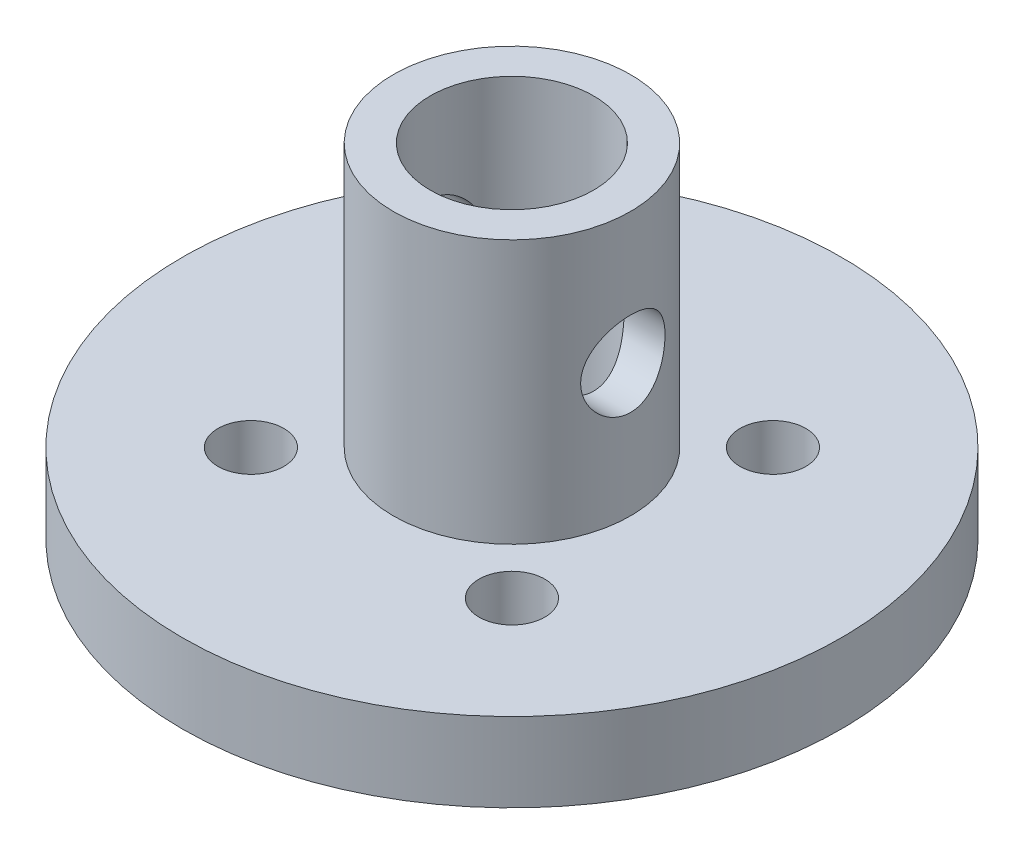
ISO-10303-21;
HEADER;
FILE_DESCRIPTION(('STEP AP214'),'2;1');
FILE_NAME('part.step','',(''),(''),'','','');
FILE_SCHEMA(('AUTOMOTIVE_DESIGN { 1 0 10303 214 1 1 1 1 }'));
ENDSEC;
DATA;
#1=APPLICATION_CONTEXT('core data for automotive mechanical design processes');
#2=APPLICATION_PROTOCOL_DEFINITION('international standard','automotive_design',2000,#1);
#3=PRODUCT_CONTEXT('',#1,'mechanical');
#4=PRODUCT('Part','Part','',(#3));
#5=PRODUCT_RELATED_PRODUCT_CATEGORY('part','',(#4));
#6=PRODUCT_DEFINITION_FORMATION('','',#4);
#7=PRODUCT_DEFINITION_CONTEXT('part definition',#1,'design');
#8=PRODUCT_DEFINITION('design','',#6,#7);
#9=PRODUCT_DEFINITION_SHAPE('','',#8);
#10=(LENGTH_UNIT() NAMED_UNIT(*) SI_UNIT(.MILLI.,.METRE.));
#11=(NAMED_UNIT(*) PLANE_ANGLE_UNIT() SI_UNIT($,.RADIAN.));
#12=(NAMED_UNIT(*) SI_UNIT($,.STERADIAN.) SOLID_ANGLE_UNIT());
#13=UNCERTAINTY_MEASURE_WITH_UNIT(LENGTH_MEASURE(1.E-05),#10,'distance_accuracy_value','');
#14=(GEOMETRIC_REPRESENTATION_CONTEXT(3) GLOBAL_UNCERTAINTY_ASSIGNED_CONTEXT((#13)) GLOBAL_UNIT_ASSIGNED_CONTEXT((#10,
#11,#12)) REPRESENTATION_CONTEXT('',''));
#15=CARTESIAN_POINT('',(0.,0.,0.));
#16=DIRECTION('',(0.,0.,1.));
#17=DIRECTION('',(1.,0.,0.));
#18=AXIS2_PLACEMENT_3D('',#15,#16,#17);
#19=CARTESIAN_POINT('',(-4.94974746830584,3.,-4.94974746830582));
#20=DIRECTION('',(0.,-1.,0.));
#21=DIRECTION('',(0.,0.,-1.));
#22=AXIS2_PLACEMENT_3D('',#19,#20,#21);
#23=CYLINDRICAL_SURFACE('',#22,1.25);
#24=CARTESIAN_POINT('',(-4.94974746830584,3.,-4.94974746830582));
#25=DIRECTION('',(0.,1.,0.));
#26=DIRECTION('',(0.,0.,1.));
#27=AXIS2_PLACEMENT_3D('',#24,#25,#26);
#28=CIRCLE('',#27,1.25);
#29=CARTESIAN_POINT('',(-4.94974746830584,3.,-3.69974746830582));
#30=VERTEX_POINT('',#29);
#31=EDGE_CURVE('E72',#30,#30,#28,.T.);
#32=ORIENTED_EDGE('',*,*,#31,.T.);
#33=EDGE_LOOP('',(#32));
#34=FACE_BOUND('',#33,.T.);
#35=CARTESIAN_POINT('',(-4.94974746830584,0.,-4.94974746830582));
#36=DIRECTION('',(0.,1.,0.));
#37=DIRECTION('',(0.,0.,1.));
#38=AXIS2_PLACEMENT_3D('',#35,#36,#37);
#39=CIRCLE('',#38,1.25);
#40=CARTESIAN_POINT('',(-4.94974746830584,0.,-3.69974746830582));
#41=VERTEX_POINT('',#40);
#42=EDGE_CURVE('E104',#41,#41,#39,.T.);
#43=ORIENTED_EDGE('',*,*,#42,.F.);
#44=EDGE_LOOP('',(#43));
#45=FACE_BOUND('',#44,.T.);
#46=ADVANCED_FACE('F51',(#34,#45),#23,.F.);
#47=CARTESIAN_POINT('',(4.94974746830584,3.,-4.94974746830581));
#48=DIRECTION('',(0.,-1.,0.));
#49=DIRECTION('',(0.,0.,-1.));
#50=AXIS2_PLACEMENT_3D('',#47,#48,#49);
#51=CYLINDRICAL_SURFACE('',#50,1.25);
#52=CARTESIAN_POINT('',(4.94974746830584,3.,-4.94974746830581));
#53=DIRECTION('',(0.,1.,0.));
#54=DIRECTION('',(0.,0.,1.));
#55=AXIS2_PLACEMENT_3D('',#52,#53,#54);
#56=CIRCLE('',#55,1.25);
#57=CARTESIAN_POINT('',(4.94974746830584,3.,-3.69974746830581));
#58=VERTEX_POINT('',#57);
#59=EDGE_CURVE('E88',#58,#58,#56,.T.);
#60=ORIENTED_EDGE('',*,*,#59,.T.);
#61=EDGE_LOOP('',(#60));
#62=FACE_BOUND('',#61,.T.);
#63=CARTESIAN_POINT('',(4.94974746830584,0.,-4.94974746830581));
#64=DIRECTION('',(0.,1.,0.));
#65=DIRECTION('',(0.,0.,1.));
#66=AXIS2_PLACEMENT_3D('',#63,#64,#65);
#67=CIRCLE('',#66,1.25);
#68=CARTESIAN_POINT('',(4.94974746830584,0.,-3.69974746830581));
#69=VERTEX_POINT('',#68);
#70=EDGE_CURVE('E101',#69,#69,#67,.T.);
#71=ORIENTED_EDGE('',*,*,#70,.F.);
#72=EDGE_LOOP('',(#71));
#73=FACE_BOUND('',#72,.T.);
#74=ADVANCED_FACE('F163',(#62,#73),#51,.F.);
#75=CARTESIAN_POINT('',(4.94974746830582,3.,4.94974746830587));
#76=DIRECTION('',(0.,-1.,0.));
#77=DIRECTION('',(0.,0.,-1.));
#78=AXIS2_PLACEMENT_3D('',#75,#76,#77);
#79=CYLINDRICAL_SURFACE('',#78,1.25);
#80=CARTESIAN_POINT('',(4.94974746830582,3.,4.94974746830587));
#81=DIRECTION('',(0.,1.,0.));
#82=DIRECTION('',(0.,0.,1.));
#83=AXIS2_PLACEMENT_3D('',#80,#81,#82);
#84=CIRCLE('',#83,1.25);
#85=CARTESIAN_POINT('',(4.94974746830582,3.,6.19974746830587));
#86=VERTEX_POINT('',#85);
#87=EDGE_CURVE('E82',#86,#86,#84,.T.);
#88=ORIENTED_EDGE('',*,*,#87,.T.);
#89=EDGE_LOOP('',(#88));
#90=FACE_BOUND('',#89,.T.);
#91=CARTESIAN_POINT('',(4.94974746830582,0.,4.94974746830587));
#92=DIRECTION('',(0.,1.,0.));
#93=DIRECTION('',(0.,0.,1.));
#94=AXIS2_PLACEMENT_3D('',#91,#92,#93);
#95=CIRCLE('',#94,1.25);
#96=CARTESIAN_POINT('',(4.94974746830582,0.,6.19974746830587));
#97=VERTEX_POINT('',#96);
#98=EDGE_CURVE('E100',#97,#97,#95,.T.);
#99=ORIENTED_EDGE('',*,*,#98,.F.);
#100=EDGE_LOOP('',(#99));
#101=FACE_BOUND('',#100,.T.);
#102=ADVANCED_FACE('F170',(#90,#101),#79,.F.);
#103=CARTESIAN_POINT('',(-4.94974746830585,3.,4.94974746830587));
#104=DIRECTION('',(0.,-1.,0.));
#105=DIRECTION('',(0.,0.,-1.));
#106=AXIS2_PLACEMENT_3D('',#103,#104,#105);
#107=CYLINDRICAL_SURFACE('',#106,1.25);
#108=CARTESIAN_POINT('',(-4.94974746830585,3.,4.94974746830587));
#109=DIRECTION('',(0.,1.,0.));
#110=DIRECTION('',(0.,0.,1.));
#111=AXIS2_PLACEMENT_3D('',#108,#109,#110);
#112=CIRCLE('',#111,1.25);
#113=CARTESIAN_POINT('',(-4.94974746830585,3.,6.19974746830587));
#114=VERTEX_POINT('',#113);
#115=EDGE_CURVE('E79',#114,#114,#112,.T.);
#116=ORIENTED_EDGE('',*,*,#115,.T.);
#117=EDGE_LOOP('',(#116));
#118=FACE_BOUND('',#117,.T.);
#119=CARTESIAN_POINT('',(-4.94974746830585,0.,4.94974746830587));
#120=DIRECTION('',(0.,1.,0.));
#121=DIRECTION('',(0.,0.,1.));
#122=AXIS2_PLACEMENT_3D('',#119,#120,#121);
#123=CIRCLE('',#122,1.25);
#124=CARTESIAN_POINT('',(-4.94974746830585,0.,6.19974746830587));
#125=VERTEX_POINT('',#124);
#126=EDGE_CURVE('E91',#125,#125,#123,.T.);
#127=ORIENTED_EDGE('',*,*,#126,.F.);
#128=EDGE_LOOP('',(#127));
#129=FACE_BOUND('',#128,.T.);
#130=ADVANCED_FACE('F52',(#118,#129),#107,.F.);
#131=CARTESIAN_POINT('',(0.,3.,0.));
#132=DIRECTION('',(0.,-1.,0.));
#133=DIRECTION('',(0.,0.,-1.));
#134=AXIS2_PLACEMENT_3D('',#131,#132,#133);
#135=CYLINDRICAL_SURFACE('',#134,12.5);
#136=CARTESIAN_POINT('',(0.,3.,0.));
#137=DIRECTION('',(0.,1.,0.));
#138=DIRECTION('',(0.,0.,1.));
#139=AXIS2_PLACEMENT_3D('',#136,#137,#138);
#140=CIRCLE('',#139,12.5);
#141=CARTESIAN_POINT('',(0.,3.,12.5));
#142=VERTEX_POINT('',#141);
#143=EDGE_CURVE('E61',#142,#142,#140,.T.);
#144=ORIENTED_EDGE('',*,*,#143,.F.);
#145=EDGE_LOOP('',(#144));
#146=FACE_BOUND('',#145,.T.);
#147=CARTESIAN_POINT('',(0.,0.,0.));
#148=DIRECTION('',(0.,1.,0.));
#149=DIRECTION('',(0.,0.,1.));
#150=AXIS2_PLACEMENT_3D('',#147,#148,#149);
#151=CIRCLE('',#150,12.5);
#152=CARTESIAN_POINT('',(0.,0.,12.5));
#153=VERTEX_POINT('',#152);
#154=EDGE_CURVE('E84',#153,#153,#151,.T.);
#155=ORIENTED_EDGE('',*,*,#154,.T.);
#156=EDGE_LOOP('',(#155));
#157=FACE_BOUND('',#156,.T.);
#158=ADVANCED_FACE('F153',(#146,#157),#135,.T.);
#159=CARTESIAN_POINT('',(0.,3.,0.));
#160=DIRECTION('',(0.,1.,0.));
#161=DIRECTION('',(0.,0.,1.));
#162=AXIS2_PLACEMENT_3D('',#159,#160,#161);
#163=PLANE('',#162);
#164=CARTESIAN_POINT('',(0.,3.,0.));
#165=DIRECTION('',(0.,1.,0.));
#166=DIRECTION('',(0.,0.,1.));
#167=AXIS2_PLACEMENT_3D('',#164,#165,#166);
#168=CIRCLE('',#167,4.5);
#169=CARTESIAN_POINT('',(0.,3.,4.5));
#170=VERTEX_POINT('',#169);
#171=EDGE_CURVE('E11',#170,#170,#168,.T.);
#172=ORIENTED_EDGE('',*,*,#171,.F.);
#173=EDGE_LOOP('',(#172));
#174=FACE_BOUND('',#173,.T.);
#175=ORIENTED_EDGE('',*,*,#115,.F.);
#176=EDGE_LOOP('',(#175));
#177=FACE_BOUND('',#176,.T.);
#178=ORIENTED_EDGE('',*,*,#87,.F.);
#179=EDGE_LOOP('',(#178));
#180=FACE_BOUND('',#179,.T.);
#181=ORIENTED_EDGE('',*,*,#59,.F.);
#182=EDGE_LOOP('',(#181));
#183=FACE_BOUND('',#182,.T.);
#184=ORIENTED_EDGE('',*,*,#31,.F.);
#185=EDGE_LOOP('',(#184));
#186=FACE_BOUND('',#185,.T.);
#187=ORIENTED_EDGE('',*,*,#143,.T.);
#188=EDGE_LOOP('',(#187));
#189=FACE_BOUND('',#188,.T.);
#190=ADVANCED_FACE('F146',(#174,#177,#180,#183,#186,#189),#163,.T.);
#191=CARTESIAN_POINT('',(0.,0.,0.));
#192=DIRECTION('',(0.,1.,0.));
#193=DIRECTION('',(0.,0.,1.));
#194=AXIS2_PLACEMENT_3D('',#191,#192,#193);
#195=PLANE('',#194);
#196=ORIENTED_EDGE('',*,*,#126,.T.);
#197=EDGE_LOOP('',(#196));
#198=FACE_BOUND('',#197,.T.);
#199=ORIENTED_EDGE('',*,*,#98,.T.);
#200=EDGE_LOOP('',(#199));
#201=FACE_BOUND('',#200,.T.);
#202=ORIENTED_EDGE('',*,*,#70,.T.);
#203=EDGE_LOOP('',(#202));
#204=FACE_BOUND('',#203,.T.);
#205=ORIENTED_EDGE('',*,*,#42,.T.);
#206=EDGE_LOOP('',(#205));
#207=FACE_BOUND('',#206,.T.);
#208=ORIENTED_EDGE('',*,*,#154,.F.);
#209=EDGE_LOOP('',(#208));
#210=FACE_BOUND('',#209,.T.);
#211=ADVANCED_FACE('F155',(#198,#201,#204,#207,#210),#195,.F.);
#212=CARTESIAN_POINT('',(0.,13.,0.));
#213=DIRECTION('',(0.,1.,0.));
#214=DIRECTION('',(0.,0.,1.));
#215=AXIS2_PLACEMENT_3D('',#212,#213,#214);
#216=PLANE('',#215);
#217=CARTESIAN_POINT('',(0.,13.,0.));
#218=DIRECTION('',(0.,1.,0.));
#219=DIRECTION('',(0.,0.,1.));
#220=AXIS2_PLACEMENT_3D('',#217,#218,#219);
#221=CIRCLE('',#220,4.5);
#222=CARTESIAN_POINT('',(0.,13.,4.5));
#223=VERTEX_POINT('',#222);
#224=EDGE_CURVE('E73',#223,#223,#221,.T.);
#225=ORIENTED_EDGE('',*,*,#224,.T.);
#226=EDGE_LOOP('',(#225));
#227=FACE_BOUND('',#226,.T.);
#228=CARTESIAN_POINT('',(0.,13.,0.));
#229=DIRECTION('',(0.,1.,0.));
#230=DIRECTION('',(0.,0.,1.));
#231=AXIS2_PLACEMENT_3D('',#228,#229,#230);
#232=CIRCLE('',#231,3.1);
#233=CARTESIAN_POINT('',(0.,13.,3.1));
#234=VERTEX_POINT('',#233);
#235=EDGE_CURVE('E267',#234,#234,#232,.T.);
#236=ORIENTED_EDGE('',*,*,#235,.F.);
#237=EDGE_LOOP('',(#236));
#238=FACE_BOUND('',#237,.T.);
#239=ADVANCED_FACE('F148',(#227,#238),#216,.T.);
#240=CARTESIAN_POINT('',(0.,13.,0.));
#241=DIRECTION('',(0.,-1.,0.));
#242=DIRECTION('',(0.,0.,-1.));
#243=AXIS2_PLACEMENT_3D('',#240,#241,#242);
#244=CYLINDRICAL_SURFACE('',#243,4.5);
#245=CARTESIAN_POINT('',(-4.20594816896262,8.,-1.6));
#246=CARTESIAN_POINT('',(-4.2059466325233,8.08676573717169,-1.60000176653876));
#247=CARTESIAN_POINT('',(-4.20866230317316,8.17351923246099,-1.59291854303746));
#248=CARTESIAN_POINT('',(-4.21916503629978,8.3444321788479,-1.56488549388392));
#249=CARTESIAN_POINT('',(-4.22695238681397,8.42859148232846,-1.54393488065575));
#250=CARTESIAN_POINT('',(-4.24660725999297,8.59180699913012,-1.48901532580341));
#251=CARTESIAN_POINT('',(-4.25846587175186,8.6708739131921,-1.45507479717298));
#252=CARTESIAN_POINT('',(-4.28491342753786,8.82222014120465,-1.37523793238815));
#253=CARTESIAN_POINT('',(-4.29950309484093,8.89449764945792,-1.32933842782722));
#254=CARTESIAN_POINT('',(-4.33049821715604,9.03343657954875,-1.22469397197854));
#255=CARTESIAN_POINT('',(-4.34695329506707,9.09975173965884,-1.16550386227185));
#256=CARTESIAN_POINT('',(-4.37940865052658,9.22175484183861,-1.03690554397058));
#257=CARTESIAN_POINT('',(-4.39540884266521,9.2774407992271,-0.967495431377929));
#258=CARTESIAN_POINT('',(-4.42573409720288,9.37822580697506,-0.817845378245919));
#259=CARTESIAN_POINT('',(-4.43999410197754,9.42295500042169,-0.737341993795029));
#260=CARTESIAN_POINT('',(-4.46464150404038,9.4980953705535,-0.569357946732584));
#261=CARTESIAN_POINT('',(-4.47503009900766,9.52851097612986,-0.481879452160409));
#262=CARTESIAN_POINT('',(-4.49041230463715,9.57296578600928,-0.306064086351644));
#263=CARTESIAN_POINT('',(-4.49560126712181,9.58759969413206,-0.217895003496384));
#264=CARTESIAN_POINT('',(-4.50069695820355,9.60197422049728,-0.0402101033913115));
#265=CARTESIAN_POINT('',(-4.50060523219942,9.60171919600052,0.0493053121862005));
#266=CARTESIAN_POINT('',(-4.49527806524339,9.58668430260994,0.22290495965723));
#267=CARTESIAN_POINT('',(-4.4902719419118,9.5725519738775,0.30705349767567));
#268=CARTESIAN_POINT('',(-4.47597306722529,9.53124401859605,0.471695779950199));
#269=CARTESIAN_POINT('',(-4.46668001702659,9.50406748272358,0.552189268981257));
#270=CARTESIAN_POINT('',(-4.44457683482582,9.43710554374688,0.708565539356494));
#271=CARTESIAN_POINT('',(-4.43171938190803,9.39714929520709,0.784368197988854));
#272=CARTESIAN_POINT('',(-4.40380656130014,9.30590799066603,0.928372679166685));
#273=CARTESIAN_POINT('',(-4.38875052802483,9.25461950158826,0.996572188915131));
#274=CARTESIAN_POINT('',(-4.35706614584535,9.1389796873181,1.12726941265176));
#275=CARTESIAN_POINT('',(-4.34039675880494,9.07407943071658,1.1892722210196));
#276=CARTESIAN_POINT('',(-4.30802023964381,8.93468052907946,1.30168812080593));
#277=CARTESIAN_POINT('',(-4.29231330191229,8.86017995440152,1.35209887656043));
#278=CARTESIAN_POINT('',(-4.26339726836409,8.70192915214762,1.4407164863627));
#279=CARTESIAN_POINT('',(-4.25023875982108,8.6180354208553,1.47868487992807));
#280=CARTESIAN_POINT('',(-4.22849275530212,8.44445603548538,1.53977696586342));
#281=CARTESIAN_POINT('',(-4.21990302236055,8.35477324001657,1.56290792408896));
#282=CARTESIAN_POINT('',(-4.20878436155374,8.17700883982522,1.59259987609534));
#283=CARTESIAN_POINT('',(-4.20597138454346,8.08907492266329,1.599938346667));
#284=CARTESIAN_POINT('',(-4.20592526250886,7.91320612370567,1.60006084059022));
#285=CARTESIAN_POINT('',(-4.20869091595066,7.82527124619604,1.5928479980256));
#286=CARTESIAN_POINT('',(-4.21920440878006,7.65566149550245,1.56477477747803));
#287=CARTESIAN_POINT('',(-4.2267435811876,7.57387773493693,1.54448538518019));
#288=CARTESIAN_POINT('',(-4.24571569518896,7.41490211860348,1.49153731182258));
#289=CARTESIAN_POINT('',(-4.25714938455108,7.33771114802199,1.45887625520133));
#290=CARTESIAN_POINT('',(-4.28311428356285,7.18712427107327,1.38082408078295));
#291=CARTESIAN_POINT('',(-4.29773959575628,7.11395453416523,1.33502880420585));
#292=CARTESIAN_POINT('',(-4.32827026027053,6.976059590963,1.23245127572623));
#293=CARTESIAN_POINT('',(-4.34417603760685,6.91133720737815,1.17566536692775));
#294=CARTESIAN_POINT('',(-4.37655106164894,6.78842539272677,1.04895384178491));
#295=CARTESIAN_POINT('',(-4.39300206653244,6.73080382070323,0.978470952986764));
#296=CARTESIAN_POINT('',(-4.42374953260242,6.62815305953574,0.828430051411223));
#297=CARTESIAN_POINT('',(-4.43804603306841,6.58312364080713,0.748872204128967));
#298=CARTESIAN_POINT('',(-4.46283245956967,6.50729942615986,0.583179723822162));
#299=CARTESIAN_POINT('',(-4.47334198935967,6.47643108958927,0.497081838670386));
#300=CARTESIAN_POINT('',(-4.48944893555702,6.42976523912031,0.320462563958086));
#301=CARTESIAN_POINT('',(-4.49504839987068,6.41396144181456,0.229943035237846));
#302=CARTESIAN_POINT('',(-4.50052895830501,6.39849836492619,0.0522106120370202));
#303=CARTESIAN_POINT('',(-4.50069711468001,6.39802861629178,-0.034923611012785));
#304=CARTESIAN_POINT('',(-4.49602458744543,6.41120323398193,-0.207972694133839));
#305=CARTESIAN_POINT('',(-4.49118440869754,6.42484617768645,-0.293887676224897));
#306=CARTESIAN_POINT('',(-4.47715852799092,6.46530247976997,-0.460318849771979));
#307=CARTESIAN_POINT('',(-4.4680622130594,6.49184533945988,-0.540908883445952));
#308=CARTESIAN_POINT('',(-4.44646479553111,6.55708844897234,-0.696511100383459));
#309=CARTESIAN_POINT('',(-4.43396305599403,6.59579097330969,-0.771522236842401));
#310=CARTESIAN_POINT('',(-4.40620368815907,6.68602017733669,-0.917104608147531));
#311=CARTESIAN_POINT('',(-4.39085607935692,6.73799650213647,-0.987379726148113));
#312=CARTESIAN_POINT('',(-4.35930983262607,6.85256300581639,-1.11846844464826));
#313=CARTESIAN_POINT('',(-4.34311090638464,6.91515679667349,-1.17927881177039));
#314=CARTESIAN_POINT('',(-4.31078383381187,7.0526270495064,-1.29258553896772));
#315=CARTESIAN_POINT('',(-4.2946934875441,7.12793717901415,-1.34456840125154));
#316=CARTESIAN_POINT('',(-4.26528713327712,7.28673376029531,-1.43513154115348));
#317=CARTESIAN_POINT('',(-4.25197089911296,7.37021954471593,-1.47371291152588));
#318=CARTESIAN_POINT('',(-4.22981442205812,7.54318843615699,-1.53615714900875));
#319=CARTESIAN_POINT('',(-4.22097742332361,7.63267583697874,-1.56000935101059));
#320=CARTESIAN_POINT('',(-4.20904652279639,7.81478117702515,-1.59192596833137));
#321=CARTESIAN_POINT('',(-4.20594980875769,7.90739756065964,-1.59999811462677));
#322=CARTESIAN_POINT('',(-4.20594816896262,8.,-1.6));
#323=B_SPLINE_CURVE_WITH_KNOTS('',3,(#245,#246,#247,#248,#249,#250,#251,#252,#253,#254,#255,
#256,#257,#258,#259,#260,#261,#262,#263,#264,#265,#266,#267,#268,#269,#270,#271,#272,#273,#274,
#275,#276,#277,#278,#279,#280,#281,#282,#283,#284,#285,#286,#287,#288,#289,#290,#291,#292,#293,
#294,#295,#296,#297,#298,#299,#300,#301,#302,#303,#304,#305,#306,#307,#308,#309,#310,#311,#312,
#313,#314,#315,#316,#317,#318,#319,#320,#321,#322),.UNSPECIFIED.,.T.,.F.,(4,2,2,2,2,2,2,2,2,2,2,
2,2,2,2,2,2,2,2,2,2,2,2,2,2,2,2,2,2,2,2,2,2,2,2,2,2,2,4),(0.,0.259953291970316,
0.519921348833399,0.779323994607176,1.03879543642786,1.30878128533634,1.57881749670462,
1.85699611078511,2.13508859452633,2.40229005360034,2.66941331629628,2.92463711542367,
3.17987870901695,3.43868609999424,3.69757200384698,3.97020163398208,4.24288614778309,
4.52052674832307,4.79803128494058,5.06152801645348,5.32496800170102,5.57761967779332,
5.83031989174368,6.09183114994743,6.3534295704366,6.62965935621094,6.90588410533624,
7.18065767081424,7.45531657824236,7.71543370133781,7.97552460606454,8.23038272661511,
8.48528854782629,8.75035401487216,9.01550983658238,9.29290814086468,9.57028382084662,
9.84786010846342,10.1253003715868),.UNSPECIFIED.);
#324=CARTESIAN_POINT('',(-4.20594816896262,8.,-1.6));
#325=VERTEX_POINT('',#324);
#326=EDGE_CURVE('E139',#325,#325,#323,.T.);
#327=ORIENTED_EDGE('',*,*,#326,.T.);
#328=EDGE_LOOP('',(#327));
#329=FACE_BOUND('',#328,.T.);
#330=CARTESIAN_POINT('',(4.20594816896262,8.,-1.6));
#331=CARTESIAN_POINT('',(4.2059466325233,7.91323426282831,-1.60000176653876));
#332=CARTESIAN_POINT('',(4.20866230317316,7.82648076753902,-1.59291854303746));
#333=CARTESIAN_POINT('',(4.21916503629978,7.65556782115211,-1.56488549388392));
#334=CARTESIAN_POINT('',(4.22695238681397,7.57140851767154,-1.54393488065575));
#335=CARTESIAN_POINT('',(4.24660725999297,7.40819300086988,-1.48901532580341));
#336=CARTESIAN_POINT('',(4.25846587175186,7.3291260868079,-1.45507479717298));
#337=CARTESIAN_POINT('',(4.28491342753786,7.17777985879535,-1.37523793238815));
#338=CARTESIAN_POINT('',(4.29950309484093,7.10550235054209,-1.32933842782722));
#339=CARTESIAN_POINT('',(4.33049821715604,6.96656342045125,-1.22469397197854));
#340=CARTESIAN_POINT('',(4.34695329506707,6.90024826034116,-1.16550386227185));
#341=CARTESIAN_POINT('',(4.37940865052658,6.77824515816139,-1.03690554397058));
#342=CARTESIAN_POINT('',(4.39540884266521,6.7225592007729,-0.96749543137793));
#343=CARTESIAN_POINT('',(4.42573409720288,6.62177419302494,-0.81784537824592));
#344=CARTESIAN_POINT('',(4.43999410197754,6.57704499957832,-0.73734199379503));
#345=CARTESIAN_POINT('',(4.46464150404038,6.5019046294465,-0.569357946732584));
#346=CARTESIAN_POINT('',(4.47503009900766,6.47148902387014,-0.481879452160409));
#347=CARTESIAN_POINT('',(4.49041230463715,6.42703421399072,-0.306064086351643));
#348=CARTESIAN_POINT('',(4.49560126712181,6.41240030586794,-0.217895003496383));
#349=CARTESIAN_POINT('',(4.50069695820355,6.39802577950272,-0.0402101033913109));
#350=CARTESIAN_POINT('',(4.50060523219942,6.39828080399948,0.0493053121862012));
#351=CARTESIAN_POINT('',(4.49527806524339,6.41331569739006,0.22290495965723));
#352=CARTESIAN_POINT('',(4.4902719419118,6.4274480261225,0.307053497675671));
#353=CARTESIAN_POINT('',(4.47597306722529,6.46875598140395,0.471695779950199));
#354=CARTESIAN_POINT('',(4.46668001702659,6.49593251727642,0.552189268981258));
#355=CARTESIAN_POINT('',(4.44457683482582,6.56289445625312,0.708565539356495));
#356=CARTESIAN_POINT('',(4.43171938190803,6.60285070479291,0.784368197988855));
#357=CARTESIAN_POINT('',(4.40380656130014,6.69409200933397,0.928372679166686));
#358=CARTESIAN_POINT('',(4.38875052802483,6.74538049841174,0.996572188915133));
#359=CARTESIAN_POINT('',(4.35706614584535,6.8610203126819,1.12726941265176));
#360=CARTESIAN_POINT('',(4.34039675880494,6.92592056928342,1.1892722210196));
#361=CARTESIAN_POINT('',(4.30802023964381,7.06531947092054,1.30168812080593));
#362=CARTESIAN_POINT('',(4.29231330191229,7.13982004559848,1.35209887656043));
#363=CARTESIAN_POINT('',(4.26339726836409,7.29807084785238,1.4407164863627));
#364=CARTESIAN_POINT('',(4.25023875982108,7.38196457914471,1.47868487992807));
#365=CARTESIAN_POINT('',(4.22849275530212,7.55554396451463,1.53977696586342));
#366=CARTESIAN_POINT('',(4.21990302236055,7.64522675998343,1.56290792408896));
#367=CARTESIAN_POINT('',(4.20878436155374,7.82299116017478,1.59259987609534));
#368=CARTESIAN_POINT('',(4.20597138454346,7.91092507733671,1.599938346667));
#369=CARTESIAN_POINT('',(4.20592526250886,8.08679387629433,1.60006084059022));
#370=CARTESIAN_POINT('',(4.20869091595066,8.17472875380396,1.5928479980256));
#371=CARTESIAN_POINT('',(4.21920440878006,8.34433850449755,1.56477477747803));
#372=CARTESIAN_POINT('',(4.2267435811876,8.42612226506307,1.54448538518019));
#373=CARTESIAN_POINT('',(4.24571569518896,8.58509788139652,1.49153731182258));
#374=CARTESIAN_POINT('',(4.25714938455108,8.66228885197801,1.45887625520133));
#375=CARTESIAN_POINT('',(4.28311428356285,8.81287572892673,1.38082408078295));
#376=CARTESIAN_POINT('',(4.29773959575628,8.88604546583478,1.33502880420585));
#377=CARTESIAN_POINT('',(4.32827026027054,9.023940409037,1.23245127572623));
#378=CARTESIAN_POINT('',(4.34417603760685,9.08866279262185,1.17566536692775));
#379=CARTESIAN_POINT('',(4.37655106164894,9.21157460727323,1.04895384178491));
#380=CARTESIAN_POINT('',(4.39300206653244,9.26919617929677,0.978470952986763));
#381=CARTESIAN_POINT('',(4.42374953260242,9.37184694046426,0.828430051411222));
#382=CARTESIAN_POINT('',(4.43804603306841,9.41687635919287,0.748872204128967));
#383=CARTESIAN_POINT('',(4.46283245956967,9.49270057384014,0.583179723822162));
#384=CARTESIAN_POINT('',(4.47334198935967,9.52356891041073,0.497081838670386));
#385=CARTESIAN_POINT('',(4.48944893555702,9.57023476087969,0.320462563958086));
#386=CARTESIAN_POINT('',(4.49504839987068,9.58603855818544,0.229943035237846));
#387=CARTESIAN_POINT('',(4.50052895830501,9.60150163507381,0.0522106120370196));
#388=CARTESIAN_POINT('',(4.50069711468001,9.60197138370822,-0.0349236110127857));
#389=CARTESIAN_POINT('',(4.49602458744543,9.58879676601807,-0.20797269413384));
#390=CARTESIAN_POINT('',(4.49118440869754,9.57515382231355,-0.293887676224897));
#391=CARTESIAN_POINT('',(4.47715852799092,9.53469752023003,-0.460318849771979));
#392=CARTESIAN_POINT('',(4.4680622130594,9.50815466054012,-0.540908883445952));
#393=CARTESIAN_POINT('',(4.44646479553111,9.44291155102766,-0.696511100383459));
#394=CARTESIAN_POINT('',(4.43396305599403,9.40420902669032,-0.771522236842402));
#395=CARTESIAN_POINT('',(4.40620368815907,9.31397982266331,-0.917104608147531));
#396=CARTESIAN_POINT('',(4.39085607935692,9.26200349786353,-0.987379726148114));
#397=CARTESIAN_POINT('',(4.35930983262607,9.14743699418361,-1.11846844464826));
#398=CARTESIAN_POINT('',(4.34311090638464,9.08484320332651,-1.17927881177039));
#399=CARTESIAN_POINT('',(4.31078383381187,8.94737295049359,-1.29258553896772));
#400=CARTESIAN_POINT('',(4.2946934875441,8.87206282098585,-1.34456840125154));
#401=CARTESIAN_POINT('',(4.26528713327712,8.71326623970469,-1.43513154115348));
#402=CARTESIAN_POINT('',(4.25197089911296,8.62978045528407,-1.47371291152588));
#403=CARTESIAN_POINT('',(4.22981442205812,8.45681156384301,-1.53615714900875));
#404=CARTESIAN_POINT('',(4.22097742332361,8.36732416302126,-1.56000935101059));
#405=CARTESIAN_POINT('',(4.20904652279639,8.18521882297485,-1.59192596833137));
#406=CARTESIAN_POINT('',(4.20594980875769,8.09260243934036,-1.59999811462677));
#407=CARTESIAN_POINT('',(4.20594816896262,8.,-1.6));
#408=B_SPLINE_CURVE_WITH_KNOTS('',3,(#330,#331,#332,#333,#334,#335,#336,#337,#338,#339,#340,
#341,#342,#343,#344,#345,#346,#347,#348,#349,#350,#351,#352,#353,#354,#355,#356,#357,#358,#359,
#360,#361,#362,#363,#364,#365,#366,#367,#368,#369,#370,#371,#372,#373,#374,#375,#376,#377,#378,
#379,#380,#381,#382,#383,#384,#385,#386,#387,#388,#389,#390,#391,#392,#393,#394,#395,#396,#397,
#398,#399,#400,#401,#402,#403,#404,#405,#406,#407),.UNSPECIFIED.,.T.,.F.,(4,2,2,2,2,2,2,2,2,2,2,
2,2,2,2,2,2,2,2,2,2,2,2,2,2,2,2,2,2,2,2,2,2,2,2,2,2,2,4),(0.,0.259953291970315,
0.519921348833399,0.779323994607176,1.03879543642786,1.30878128533634,1.57881749670462,
1.85699611078511,2.13508859452633,2.40229005360034,2.66941331629628,2.92463711542367,
3.17987870901695,3.43868609999425,3.69757200384699,3.97020163398209,4.24288614778309,
4.52052674832307,4.79803128494058,5.06152801645349,5.32496800170102,5.57761967779331,
5.83031989174368,6.09183114994743,6.35342957043661,6.62965935621094,6.90588410533624,
7.18065767081424,7.45531657824236,7.71543370133781,7.97552460606454,8.23038272661511,
8.48528854782629,8.75035401487216,9.01550983658238,9.29290814086468,9.57028382084662,
9.84786010846342,10.1253003715868),.UNSPECIFIED.);
#409=CARTESIAN_POINT('',(4.20594816896262,8.,-1.6));
#410=VERTEX_POINT('',#409);
#411=EDGE_CURVE('E128',#410,#410,#408,.T.);
#412=ORIENTED_EDGE('',*,*,#411,.T.);
#413=EDGE_LOOP('',(#412));
#414=FACE_BOUND('',#413,.T.);
#415=ORIENTED_EDGE('',*,*,#224,.F.);
#416=EDGE_LOOP('',(#415));
#417=FACE_BOUND('',#416,.T.);
#418=ORIENTED_EDGE('',*,*,#171,.T.);
#419=EDGE_LOOP('',(#418));
#420=FACE_BOUND('',#419,.T.);
#421=ADVANCED_FACE('F142',(#329,#414,#417,#420),#244,.T.);
#422=CARTESIAN_POINT('',(0.,13.,0.));
#423=DIRECTION('',(0.,-1.,0.));
#424=DIRECTION('',(0.,0.,-1.));
#425=AXIS2_PLACEMENT_3D('',#422,#423,#424);
#426=CYLINDRICAL_SURFACE('',#425,3.1);
#427=CARTESIAN_POINT('',(-2.65518360947035,8.,-1.6));
#428=CARTESIAN_POINT('',(-2.65519151870765,8.08294643900522,-1.59999388742595));
#429=CARTESIAN_POINT('',(-2.65913029042253,8.16598790111819,-1.59350625320003));
#430=CARTESIAN_POINT('',(-2.67430159483681,8.32948746208088,-1.56790233583637));
#431=CARTESIAN_POINT('',(-2.68554845529078,8.40994015969311,-1.54876124388617));
#432=CARTESIAN_POINT('',(-2.71367806337924,8.56558383458468,-1.49891871291073));
#433=CARTESIAN_POINT('',(-2.73052922790912,8.64080150403208,-1.46828193654929));
#434=CARTESIAN_POINT('',(-2.76791910457772,8.78500845675873,-1.39651578025947));
#435=CARTESIAN_POINT('',(-2.78845821589638,8.85399706459412,-1.35538526429544));
#436=CARTESIAN_POINT('',(-2.83311972659841,8.99049986642284,-1.25954887377542));
#437=CARTESIAN_POINT('',(-2.85739839276573,9.05734715199552,-1.20396553052022));
#438=CARTESIAN_POINT('',(-2.90554505407935,9.18129466215673,-1.08262206499365));
#439=CARTESIAN_POINT('',(-2.92941282658187,9.23838974324279,-1.01685660712143));
#440=CARTESIAN_POINT('',(-2.97613003591481,9.34529914796317,-0.871155896543977));
#441=CARTESIAN_POINT('',(-2.99877797688331,9.39427783453717,-0.790536747438751));
#442=CARTESIAN_POINT('',(-3.0384472769991,9.47767076528095,-0.620814116943533));
#443=CARTESIAN_POINT('',(-3.05547241411756,9.51209479312526,-0.531716384387884));
#444=CARTESIAN_POINT('',(-3.08084678217074,9.5627086808506,-0.35464422397306));
#445=CARTESIAN_POINT('',(-3.0897509299444,9.58007244740209,-0.267086703555101));
#446=CARTESIAN_POINT('',(-3.09996403153832,9.59995448600997,-0.0898848914755392));
#447=CARTESIAN_POINT('',(-3.10127793182017,9.60248242639059,-0.000241997081725466));
#448=CARTESIAN_POINT('',(-3.09641118331153,9.59303816310821,0.169694607273892));
#449=CARTESIAN_POINT('',(-3.09091266311087,9.58238583469822,0.250085985181621));
#450=CARTESIAN_POINT('',(-3.07408943171113,9.54926721581162,0.407750751010129));
#451=CARTESIAN_POINT('',(-3.0627642817463,9.52680003563224,0.485023903644904));
#452=CARTESIAN_POINT('',(-3.03513006867877,9.4705847510784,0.635549898303638));
#453=CARTESIAN_POINT('',(-3.01875792741166,9.436693332594,0.708737158210843));
#454=CARTESIAN_POINT('',(-2.98247907367701,9.35881119112845,0.848553586124061));
#455=CARTESIAN_POINT('',(-2.96257112903263,9.31481694588607,0.915180455305616));
#456=CARTESIAN_POINT('',(-2.91873712296864,9.21298957942451,1.04702644897866));
#457=CARTESIAN_POINT('',(-2.89460838809652,9.15421775324754,1.1114536412409));
#458=CARTESIAN_POINT('',(-2.84627070937686,9.02699585449072,1.2299790847691));
#459=CARTESIAN_POINT('',(-2.82206171470252,8.95853757775291,1.28406848796886));
#460=CARTESIAN_POINT('',(-2.77441481850574,8.80797670312024,1.38416407525395));
#461=CARTESIAN_POINT('',(-2.75115323807477,8.72525089028647,1.42932542469555));
#462=CARTESIAN_POINT('',(-2.71063776899113,8.5519182813137,1.50475687723723));
#463=CARTESIAN_POINT('',(-2.69337731710792,8.46132023123003,1.53504326363845));
#464=CARTESIAN_POINT('',(-2.66881749427603,8.28244774559923,1.57733033609792));
#465=CARTESIAN_POINT('',(-2.66082780651202,8.1945738726701,1.59060732124528));
#466=CARTESIAN_POINT('',(-2.65377295932826,8.01751418246883,1.60235661248839));
#467=CARTESIAN_POINT('',(-2.65470046799336,7.92832950321076,1.600841081301));
#468=CARTESIAN_POINT('',(-2.66464103972281,7.76264516839368,1.58421973624243));
#469=CARTESIAN_POINT('',(-2.67266835574031,7.68590980466254,1.5707701479776));
#470=CARTESIAN_POINT('',(-2.69440714305332,7.53595176928258,1.53317904487181));
#471=CARTESIAN_POINT('',(-2.70812062210269,7.46273034858762,1.50903375322901));
#472=CARTESIAN_POINT('',(-2.74040989593582,7.31805032299794,1.44960053304785));
#473=CARTESIAN_POINT('',(-2.75917915543224,7.24682496057216,1.41385406736642));
#474=CARTESIAN_POINT('',(-2.79931488142368,7.11096434494832,1.33262441274002));
#475=CARTESIAN_POINT('',(-2.82068268259545,7.04633250995806,1.28713621098714));
#476=CARTESIAN_POINT('',(-2.86709857476001,6.91628769502832,1.18049376248502));
#477=CARTESIAN_POINT('',(-2.89225187397236,6.8519646373067,1.1180501408822));
#478=CARTESIAN_POINT('',(-2.94092354286865,6.73433790043616,0.982917389043532));
#479=CARTESIAN_POINT('',(-2.96444123843717,6.68103874714289,0.910224071318091));
#480=CARTESIAN_POINT('',(-3.0081861151562,6.58541418458171,0.753425210602881));
#481=CARTESIAN_POINT('',(-3.02827777612424,6.54351290769964,0.669020428724364));
#482=CARTESIAN_POINT('',(-3.06184959241567,6.47493525642896,0.493024616781187));
#483=CARTESIAN_POINT('',(-3.07533591467361,6.44824467707135,0.401440382709947));
#484=CARTESIAN_POINT('',(-3.09313360894805,6.41328128535996,0.223109562676679));
#485=CARTESIAN_POINT('',(-3.09819732777695,6.40349474152281,0.136734600803562));
#486=CARTESIAN_POINT('',(-3.10099341105622,6.39807348431961,-0.0365637824951885));
#487=CARTESIAN_POINT('',(-3.09872870476173,6.40243311656749,-0.123486970925716));
#488=CARTESIAN_POINT('',(-3.08755734948613,6.42421903832817,-0.288704567748849));
#489=CARTESIAN_POINT('',(-3.07914802730647,6.44066745040741,-0.367165432226739));
#490=CARTESIAN_POINT('',(-3.05704148583192,6.48478839788817,-0.520065236792491));
#491=CARTESIAN_POINT('',(-3.04334355322409,6.51246244739768,-0.594503632796518));
#492=CARTESIAN_POINT('',(-3.01118630261761,6.57938812661173,-0.74066580736759));
#493=CARTESIAN_POINT('',(-2.99255608546004,6.61906461383058,-0.812156272431014));
#494=CARTESIAN_POINT('',(-2.95242043202372,6.70834379914774,-0.947745490528871));
#495=CARTESIAN_POINT('',(-2.93091370293984,6.75795096544959,-1.01184089569718));
#496=CARTESIAN_POINT('',(-2.88445656488696,6.87169913427229,-1.13792958905909));
#497=CARTESIAN_POINT('',(-2.8593816517512,6.93681915741608,-1.19899593079336));
#498=CARTESIAN_POINT('',(-2.81039460453547,7.07663540222904,-1.30971633245753));
#499=CARTESIAN_POINT('',(-2.78648363703664,7.15134096922959,-1.35935912138904));
#500=CARTESIAN_POINT('',(-2.74167733772089,7.3122432156844,-1.44767502489553));
#501=CARTESIAN_POINT('',(-2.72095050200207,7.39879038828461,-1.48580086655333));
#502=CARTESIAN_POINT('',(-2.68700955560966,7.57845227719175,-1.54635477071901));
#503=CARTESIAN_POINT('',(-2.67377052627881,7.67154403681327,-1.56883495864879));
#504=CARTESIAN_POINT('',(-2.66206770773013,7.80479398203497,-1.58853029418332));
#505=CARTESIAN_POINT('',(-2.65949687346548,7.84365756111136,-1.59282370796993));
#506=CARTESIAN_POINT('',(-2.65605290289794,7.92167368318045,-1.59856009455665));
#507=CARTESIAN_POINT('',(-2.65517987411374,7.96082624431623,-1.60000288683258));
#508=CARTESIAN_POINT('',(-2.65518360947035,8.,-1.6));
#509=B_SPLINE_CURVE_WITH_KNOTS('',3,(#427,#428,#429,#430,#431,#432,#433,#434,#435,#436,#437,
#438,#439,#440,#441,#442,#443,#444,#445,#446,#447,#448,#449,#450,#451,#452,#453,#454,#455,#456,
#457,#458,#459,#460,#461,#462,#463,#464,#465,#466,#467,#468,#469,#470,#471,#472,#473,#474,#475,
#476,#477,#478,#479,#480,#481,#482,#483,#484,#485,#486,#487,#488,#489,#490,#491,#492,#493,#494,
#495,#496,#497,#498,#499,#500,#501,#502,#503,#504,#505,#506,#507,#508),.UNSPECIFIED.,.T.,.F.,(4,
2,2,2,2,2,2,2,2,2,2,2,2,2,2,2,2,2,2,2,2,2,2,2,2,2,2,2,2,2,2,2,2,2,2,2,2,2,2,2,4),(0.,
0.248674165279169,0.497837341652299,0.745619500663184,0.993428495569596,1.2630976251238,
1.53290854716819,1.82241362913143,2.11172379452941,2.37933615725737,2.6467741009388,
2.88946942992208,3.13218303739395,3.3780623386805,3.62402749410924,3.89433571136826,
4.16487425817251,4.45459119292709,4.743990269983,5.0100805575622,5.27595207857428,
5.50985103570411,5.74383265173443,5.98850057290713,6.23329469672969,6.51139142105761,
6.78960209214661,7.07706958846399,7.36426818279455,7.62407682983262,7.88378164121992,
8.12451323840757,8.36527731614681,8.61582737218386,8.86649041496404,9.14346618796127,
9.42071407725789,9.70958763465175,9.99749410671859,10.1149299395444,10.232373209109),.UNSPECIFIED.);
#510=CARTESIAN_POINT('',(-2.65518360947035,8.,-1.6));
#511=VERTEX_POINT('',#510);
#512=EDGE_CURVE('E54',#511,#511,#509,.T.);
#513=ORIENTED_EDGE('',*,*,#512,.F.);
#514=EDGE_LOOP('',(#513));
#515=FACE_BOUND('',#514,.T.);
#516=CARTESIAN_POINT('',(2.65518360947035,8.,-1.6));
#517=CARTESIAN_POINT('',(2.65519151870765,7.91705356099478,-1.59999388742595));
#518=CARTESIAN_POINT('',(2.65913029042253,7.83401209888181,-1.59350625320003));
#519=CARTESIAN_POINT('',(2.67430159483681,7.67051253791912,-1.56790233583637));
#520=CARTESIAN_POINT('',(2.68554845529078,7.59005984030689,-1.54876124388617));
#521=CARTESIAN_POINT('',(2.71367806337924,7.43441616541532,-1.49891871291073));
#522=CARTESIAN_POINT('',(2.73052922790912,7.35919849596792,-1.46828193654929));
#523=CARTESIAN_POINT('',(2.76791910457772,7.21499154324127,-1.39651578025947));
#524=CARTESIAN_POINT('',(2.78845821589638,7.14600293540588,-1.35538526429544));
#525=CARTESIAN_POINT('',(2.83311972659841,7.00950013357716,-1.25954887377542));
#526=CARTESIAN_POINT('',(2.85739839276573,6.94265284800448,-1.20396553052022));
#527=CARTESIAN_POINT('',(2.90554505407935,6.81870533784328,-1.08262206499365));
#528=CARTESIAN_POINT('',(2.92941282658187,6.76161025675721,-1.01685660712143));
#529=CARTESIAN_POINT('',(2.97613003591481,6.65470085203683,-0.871155896543977));
#530=CARTESIAN_POINT('',(2.99877797688331,6.60572216546283,-0.790536747438751));
#531=CARTESIAN_POINT('',(3.0384472769991,6.52232923471905,-0.620814116943532));
#532=CARTESIAN_POINT('',(3.05547241411756,6.48790520687474,-0.531716384387882));
#533=CARTESIAN_POINT('',(3.08084678217074,6.4372913191494,-0.354644223973059));
#534=CARTESIAN_POINT('',(3.0897509299444,6.41992755259791,-0.267086703555099));
#535=CARTESIAN_POINT('',(3.09996403153832,6.40004551399003,-0.0898848914755382));
#536=CARTESIAN_POINT('',(3.10127793182017,6.39751757360941,-0.000241997081724775));
#537=CARTESIAN_POINT('',(3.09641118331153,6.40696183689179,0.169694607273893));
#538=CARTESIAN_POINT('',(3.09091266311087,6.41761416530178,0.250085985181622));
#539=CARTESIAN_POINT('',(3.07408943171113,6.45073278418837,0.40775075101013));
#540=CARTESIAN_POINT('',(3.0627642817463,6.47319996436776,0.485023903644904));
#541=CARTESIAN_POINT('',(3.03513006867877,6.5294152489216,0.635549898303639));
#542=CARTESIAN_POINT('',(3.01875792741166,6.56330666740601,0.708737158210844));
#543=CARTESIAN_POINT('',(2.982479073677,6.64118880887155,0.848553586124062));
#544=CARTESIAN_POINT('',(2.96257112903263,6.68518305411393,0.915180455305617));
#545=CARTESIAN_POINT('',(2.91873712296864,6.78701042057549,1.04702644897866));
#546=CARTESIAN_POINT('',(2.89460838809652,6.84578224675246,1.1114536412409));
#547=CARTESIAN_POINT('',(2.84627070937686,6.97300414550928,1.2299790847691));
#548=CARTESIAN_POINT('',(2.82206171470252,7.04146242224709,1.28406848796886));
#549=CARTESIAN_POINT('',(2.77441481850574,7.19202329687976,1.38416407525395));
#550=CARTESIAN_POINT('',(2.75115323807477,7.27474910971354,1.42932542469555));
#551=CARTESIAN_POINT('',(2.71063776899113,7.4480817186863,1.50475687723723));
#552=CARTESIAN_POINT('',(2.69337731710792,7.53867976876997,1.53504326363845));
#553=CARTESIAN_POINT('',(2.66881749427603,7.71755225440077,1.57733033609792));
#554=CARTESIAN_POINT('',(2.66082780651202,7.8054261273299,1.59060732124528));
#555=CARTESIAN_POINT('',(2.65377295932826,7.98248581753117,1.60235661248839));
#556=CARTESIAN_POINT('',(2.65470046799337,8.07167049678924,1.600841081301));
#557=CARTESIAN_POINT('',(2.66464103972281,8.23735483160632,1.58421973624243));
#558=CARTESIAN_POINT('',(2.67266835574031,8.31409019533746,1.5707701479776));
#559=CARTESIAN_POINT('',(2.69440714305332,8.46404823071742,1.53317904487181));
#560=CARTESIAN_POINT('',(2.70812062210269,8.53726965141238,1.50903375322901));
#561=CARTESIAN_POINT('',(2.74040989593582,8.68194967700206,1.44960053304785));
#562=CARTESIAN_POINT('',(2.75917915543224,8.75317503942784,1.41385406736642));
#563=CARTESIAN_POINT('',(2.79931488142368,8.88903565505168,1.33262441274002));
#564=CARTESIAN_POINT('',(2.82068268259545,8.95366749004194,1.28713621098714));
#565=CARTESIAN_POINT('',(2.86709857476001,9.08371230497169,1.18049376248502));
#566=CARTESIAN_POINT('',(2.89225187397236,9.14803536269331,1.1180501408822));
#567=CARTESIAN_POINT('',(2.94092354286865,9.26566209956384,0.982917389043532));
#568=CARTESIAN_POINT('',(2.96444123843717,9.31896125285711,0.910224071318091));
#569=CARTESIAN_POINT('',(3.0081861151562,9.41458581541829,0.753425210602881));
#570=CARTESIAN_POINT('',(3.02827777612424,9.45648709230036,0.669020428724364));
#571=CARTESIAN_POINT('',(3.06184959241567,9.52506474357105,0.493024616781187));
#572=CARTESIAN_POINT('',(3.07533591467361,9.55175532292865,0.401440382709946));
#573=CARTESIAN_POINT('',(3.09313360894805,9.58671871464004,0.223109562676678));
#574=CARTESIAN_POINT('',(3.09819732777695,9.59650525847719,0.136734600803562));
#575=CARTESIAN_POINT('',(3.10099341105622,9.60192651568039,-0.0365637824951893));
#576=CARTESIAN_POINT('',(3.09872870476173,9.59756688343251,-0.123486970925716));
#577=CARTESIAN_POINT('',(3.08755734948613,9.57578096167183,-0.288704567748849));
#578=CARTESIAN_POINT('',(3.07914802730647,9.55933254959259,-0.367165432226739));
#579=CARTESIAN_POINT('',(3.05704148583192,9.51521160211182,-0.520065236792491));
#580=CARTESIAN_POINT('',(3.04334355322409,9.48753755260232,-0.594503632796518));
#581=CARTESIAN_POINT('',(3.01118630261761,9.42061187338827,-0.740665807367591));
#582=CARTESIAN_POINT('',(2.99255608546004,9.38093538616942,-0.812156272431015));
#583=CARTESIAN_POINT('',(2.95242043202372,9.29165620085226,-0.947745490528871));
#584=CARTESIAN_POINT('',(2.93091370293984,9.24204903455041,-1.01184089569718));
#585=CARTESIAN_POINT('',(2.88445656488696,9.12830086572771,-1.1379295890591));
#586=CARTESIAN_POINT('',(2.8593816517512,9.06318084258392,-1.19899593079336));
#587=CARTESIAN_POINT('',(2.81039460453547,8.92336459777096,-1.30971633245753));
#588=CARTESIAN_POINT('',(2.78648363703664,8.84865903077041,-1.35935912138904));
#589=CARTESIAN_POINT('',(2.74167733772089,8.6877567843156,-1.44767502489553));
#590=CARTESIAN_POINT('',(2.72095050200207,8.60120961171539,-1.48580086655333));
#591=CARTESIAN_POINT('',(2.68700955560966,8.42154772280825,-1.54635477071901));
#592=CARTESIAN_POINT('',(2.67377052627881,8.32845596318673,-1.56883495864879));
#593=CARTESIAN_POINT('',(2.66206770773013,8.19520601796503,-1.58853029418332));
#594=CARTESIAN_POINT('',(2.65949687346548,8.15634243888864,-1.59282370796993));
#595=CARTESIAN_POINT('',(2.65605290289794,8.07832631681955,-1.59856009455665));
#596=CARTESIAN_POINT('',(2.65517987411374,8.03917375568377,-1.60000288683258));
#597=CARTESIAN_POINT('',(2.65518360947035,8.,-1.6));
#598=B_SPLINE_CURVE_WITH_KNOTS('',3,(#516,#517,#518,#519,#520,#521,#522,#523,#524,#525,#526,
#527,#528,#529,#530,#531,#532,#533,#534,#535,#536,#537,#538,#539,#540,#541,#542,#543,#544,#545,
#546,#547,#548,#549,#550,#551,#552,#553,#554,#555,#556,#557,#558,#559,#560,#561,#562,#563,#564,
#565,#566,#567,#568,#569,#570,#571,#572,#573,#574,#575,#576,#577,#578,#579,#580,#581,#582,#583,
#584,#585,#586,#587,#588,#589,#590,#591,#592,#593,#594,#595,#596,#597),.UNSPECIFIED.,.T.,.F.,(4,
2,2,2,2,2,2,2,2,2,2,2,2,2,2,2,2,2,2,2,2,2,2,2,2,2,2,2,2,2,2,2,2,2,2,2,2,2,2,2,4),(0.,
0.248674165279169,0.4978373416523,0.745619500663185,0.993428495569596,1.2630976251238,
1.53290854716819,1.82241362913143,2.11172379452942,2.37933615725737,2.64677410093881,
2.88946942992208,3.13218303739395,3.3780623386805,3.62402749410924,3.89433571136826,
4.16487425817251,4.45459119292709,4.743990269983,5.0100805575622,5.27595207857428,
5.50985103570411,5.74383265173443,5.98850057290713,6.23329469672969,6.51139142105761,
6.78960209214661,7.07706958846399,7.36426818279455,7.62407682983262,7.88378164121992,
8.12451323840757,8.36527731614681,8.61582737218386,8.86649041496404,9.14346618796127,
9.42071407725789,9.70958763465175,9.99749410671859,10.1149299395444,10.232373209109),.UNSPECIFIED.);
#599=CARTESIAN_POINT('',(2.65518360947035,8.,-1.6));
#600=VERTEX_POINT('',#599);
#601=EDGE_CURVE('E112',#600,#600,#598,.T.);
#602=ORIENTED_EDGE('',*,*,#601,.F.);
#603=EDGE_LOOP('',(#602));
#604=FACE_BOUND('',#603,.T.);
#605=ORIENTED_EDGE('',*,*,#235,.T.);
#606=EDGE_LOOP('',(#605));
#607=FACE_BOUND('',#606,.T.);
#608=CARTESIAN_POINT('',(0.,3.,0.));
#609=DIRECTION('',(0.,1.,0.));
#610=DIRECTION('',(0.,0.,1.));
#611=AXIS2_PLACEMENT_3D('',#608,#609,#610);
#612=CIRCLE('',#611,3.1);
#613=CARTESIAN_POINT('',(0.,3.,3.1));
#614=VERTEX_POINT('',#613);
#615=EDGE_CURVE('E275',#614,#614,#612,.T.);
#616=ORIENTED_EDGE('',*,*,#615,.F.);
#617=EDGE_LOOP('',(#616));
#618=FACE_BOUND('',#617,.T.);
#619=ADVANCED_FACE('F119',(#515,#604,#607,#618),#426,.F.);
#620=ORIENTED_EDGE('',*,*,#615,.T.);
#621=EDGE_LOOP('',(#620));
#622=FACE_BOUND('',#621,.T.);
#623=ADVANCED_FACE('F154',(#622),#163,.T.);
#624=CARTESIAN_POINT('',(-12.5,8.,0.));
#625=DIRECTION('',(1.,0.,0.));
#626=DIRECTION('',(0.,0.,-1.));
#627=AXIS2_PLACEMENT_3D('',#624,#625,#626);
#628=CYLINDRICAL_SURFACE('',#627,1.6);
#629=ORIENTED_EDGE('',*,*,#601,.T.);
#630=EDGE_LOOP('',(#629));
#631=FACE_BOUND('',#630,.T.);
#632=ORIENTED_EDGE('',*,*,#411,.F.);
#633=EDGE_LOOP('',(#632));
#634=FACE_BOUND('',#633,.T.);
#635=ADVANCED_FACE('F125',(#631,#634),#628,.F.);
#636=ORIENTED_EDGE('',*,*,#512,.T.);
#637=EDGE_LOOP('',(#636));
#638=FACE_BOUND('',#637,.T.);
#639=ORIENTED_EDGE('',*,*,#326,.F.);
#640=EDGE_LOOP('',(#639));
#641=FACE_BOUND('',#640,.T.);
#642=ADVANCED_FACE('F116',(#638,#641),#628,.F.);
#643=CLOSED_SHELL('',(#46,#74,#102,#130,#158,#190,#211,#239,#421,#619,#623,#635,#642));
#644=MANIFOLD_SOLID_BREP('B2',#643);
#645=ADVANCED_BREP_SHAPE_REPRESENTATION('',(#18,#644),#14);
#646=SHAPE_DEFINITION_REPRESENTATION(#9,#645);
ENDSEC;
END-ISO-10303-21;
